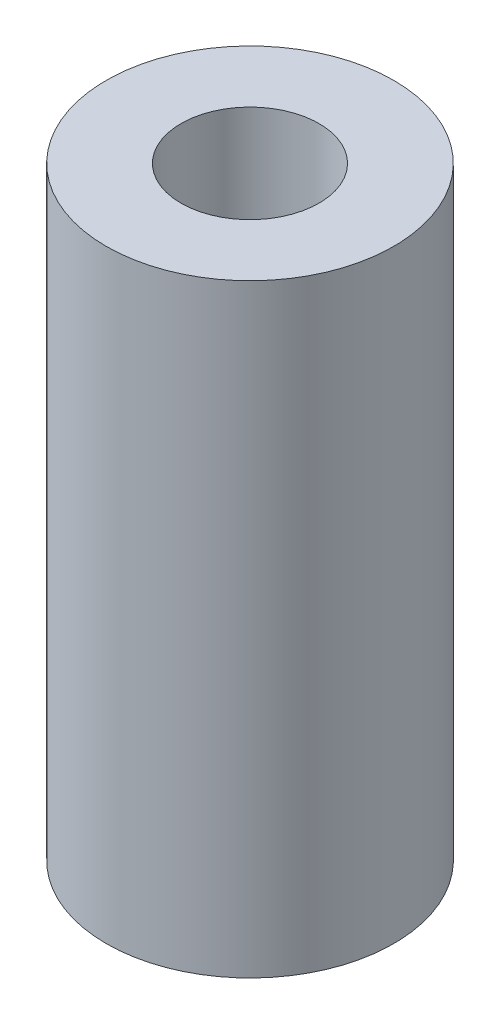
ISO-10303-21;
HEADER;
FILE_DESCRIPTION(('STEP AP214'),'2;1');
FILE_NAME('part.step','',(''),(''),'','','');
FILE_SCHEMA(('AUTOMOTIVE_DESIGN { 1 0 10303 214 1 1 1 1 }'));
ENDSEC;
DATA;
#1=APPLICATION_CONTEXT('core data for automotive mechanical design processes');
#2=APPLICATION_PROTOCOL_DEFINITION('international standard','automotive_design',2000,#1);
#3=PRODUCT_CONTEXT('',#1,'mechanical');
#4=PRODUCT('Part','Part','',(#3));
#5=PRODUCT_RELATED_PRODUCT_CATEGORY('part','',(#4));
#6=PRODUCT_DEFINITION_FORMATION('','',#4);
#7=PRODUCT_DEFINITION_CONTEXT('part definition',#1,'design');
#8=PRODUCT_DEFINITION('design','',#6,#7);
#9=PRODUCT_DEFINITION_SHAPE('','',#8);
#10=(LENGTH_UNIT() NAMED_UNIT(*) SI_UNIT(.MILLI.,.METRE.));
#11=(NAMED_UNIT(*) PLANE_ANGLE_UNIT() SI_UNIT($,.RADIAN.));
#12=(NAMED_UNIT(*) SI_UNIT($,.STERADIAN.) SOLID_ANGLE_UNIT());
#13=UNCERTAINTY_MEASURE_WITH_UNIT(LENGTH_MEASURE(1.E-05),#10,'distance_accuracy_value','');
#14=(GEOMETRIC_REPRESENTATION_CONTEXT(3) GLOBAL_UNCERTAINTY_ASSIGNED_CONTEXT((#13)) GLOBAL_UNIT_ASSIGNED_CONTEXT((#10,
#11,#12)) REPRESENTATION_CONTEXT('',''));
#15=CARTESIAN_POINT('',(0.,0.,0.));
#16=DIRECTION('',(0.,0.,1.));
#17=DIRECTION('',(1.,0.,0.));
#18=AXIS2_PLACEMENT_3D('',#15,#16,#17);
#19=CARTESIAN_POINT('',(0.,5.25,0.));
#20=DIRECTION('',(0.,-1.,0.));
#21=DIRECTION('',(0.,0.,-1.));
#22=AXIS2_PLACEMENT_3D('',#19,#20,#21);
#23=CYLINDRICAL_SURFACE('',#22,2.5);
#24=CARTESIAN_POINT('',(0.,5.25,0.));
#25=DIRECTION('',(0.,1.,0.));
#26=DIRECTION('',(0.,0.,1.));
#27=AXIS2_PLACEMENT_3D('',#24,#25,#26);
#28=CIRCLE('',#27,2.5);
#29=CARTESIAN_POINT('',(0.,5.25,-2.5));
#30=VERTEX_POINT('',#29);
#31=EDGE_CURVE('E10',#30,#30,#28,.T.);
#32=CARTESIAN_POINT('',(0.,-5.25,0.));
#33=DIRECTION('',(0.,1.,0.));
#34=DIRECTION('',(0.,0.,1.));
#35=AXIS2_PLACEMENT_3D('',#32,#33,#34);
#36=CIRCLE('',#35,2.5);
#37=CARTESIAN_POINT('',(0.,-5.25,-2.5));
#38=VERTEX_POINT('',#37);
#39=EDGE_CURVE('E37',#38,#38,#36,.T.);
#40=CARTESIAN_POINT('',(0.,5.25,-2.5));
#41=CARTESIAN_POINT('',(0.,5.140625,-2.5));
#42=CARTESIAN_POINT('',(0.,5.03125,-2.5));
#43=CARTESIAN_POINT('',(0.,4.8125,-2.5));
#44=CARTESIAN_POINT('',(0.,4.703125,-2.5));
#45=CARTESIAN_POINT('',(0.,4.484375,-2.5));
#46=CARTESIAN_POINT('',(0.,4.375,-2.5));
#47=CARTESIAN_POINT('',(0.,4.15625,-2.5));
#48=CARTESIAN_POINT('',(0.,4.046875,-2.5));
#49=CARTESIAN_POINT('',(0.,3.828125,-2.5));
#50=CARTESIAN_POINT('',(0.,3.71875,-2.5));
#51=CARTESIAN_POINT('',(0.,3.5,-2.5));
#52=CARTESIAN_POINT('',(0.,3.390625,-2.5));
#53=CARTESIAN_POINT('',(0.,3.171875,-2.5));
#54=CARTESIAN_POINT('',(0.,3.0625,-2.5));
#55=CARTESIAN_POINT('',(0.,2.84375,-2.5));
#56=CARTESIAN_POINT('',(0.,2.734375,-2.5));
#57=CARTESIAN_POINT('',(0.,2.515625,-2.5));
#58=CARTESIAN_POINT('',(0.,2.40625,-2.5));
#59=CARTESIAN_POINT('',(0.,2.1875,-2.5));
#60=CARTESIAN_POINT('',(0.,2.078125,-2.5));
#61=CARTESIAN_POINT('',(0.,1.859375,-2.5));
#62=CARTESIAN_POINT('',(0.,1.75,-2.5));
#63=CARTESIAN_POINT('',(0.,1.53125,-2.5));
#64=CARTESIAN_POINT('',(0.,1.421875,-2.5));
#65=CARTESIAN_POINT('',(0.,1.203125,-2.5));
#66=CARTESIAN_POINT('',(0.,1.09375,-2.5));
#67=CARTESIAN_POINT('',(0.,0.874999999999999,-2.5));
#68=CARTESIAN_POINT('',(0.,0.765624999999999,-2.5));
#69=CARTESIAN_POINT('',(0.,0.546875,-2.5));
#70=CARTESIAN_POINT('',(0.,0.4375,-2.5));
#71=CARTESIAN_POINT('',(0.,0.218749999999999,-2.5));
#72=CARTESIAN_POINT('',(0.,0.109374999999999,-2.5));
#73=CARTESIAN_POINT('',(0.,-0.109375000000001,-2.5));
#74=CARTESIAN_POINT('',(0.,-0.218750000000001,-2.5));
#75=CARTESIAN_POINT('',(0.,-0.437500000000001,-2.5));
#76=CARTESIAN_POINT('',(0.,-0.546875000000001,-2.5));
#77=CARTESIAN_POINT('',(0.,-0.765625000000001,-2.5));
#78=CARTESIAN_POINT('',(0.,-0.875000000000001,-2.5));
#79=CARTESIAN_POINT('',(0.,-1.09375,-2.5));
#80=CARTESIAN_POINT('',(0.,-1.203125,-2.5));
#81=CARTESIAN_POINT('',(0.,-1.421875,-2.5));
#82=CARTESIAN_POINT('',(0.,-1.53125,-2.5));
#83=CARTESIAN_POINT('',(0.,-1.75,-2.5));
#84=CARTESIAN_POINT('',(0.,-1.859375,-2.5));
#85=CARTESIAN_POINT('',(0.,-2.078125,-2.5));
#86=CARTESIAN_POINT('',(0.,-2.1875,-2.5));
#87=CARTESIAN_POINT('',(0.,-2.40625,-2.5));
#88=CARTESIAN_POINT('',(0.,-2.515625,-2.5));
#89=CARTESIAN_POINT('',(0.,-2.734375,-2.5));
#90=CARTESIAN_POINT('',(0.,-2.84375,-2.5));
#91=CARTESIAN_POINT('',(0.,-3.0625,-2.5));
#92=CARTESIAN_POINT('',(0.,-3.171875,-2.5));
#93=CARTESIAN_POINT('',(0.,-3.390625,-2.5));
#94=CARTESIAN_POINT('',(0.,-3.5,-2.5));
#95=CARTESIAN_POINT('',(0.,-3.71875,-2.5));
#96=CARTESIAN_POINT('',(0.,-3.828125,-2.5));
#97=CARTESIAN_POINT('',(0.,-4.046875,-2.5));
#98=CARTESIAN_POINT('',(0.,-4.15625,-2.5));
#99=CARTESIAN_POINT('',(0.,-4.375,-2.5));
#100=CARTESIAN_POINT('',(0.,-4.484375,-2.5));
#101=CARTESIAN_POINT('',(0.,-4.703125,-2.5));
#102=CARTESIAN_POINT('',(0.,-4.8125,-2.5));
#103=CARTESIAN_POINT('',(0.,-5.03125,-2.5));
#104=CARTESIAN_POINT('',(0.,-5.140625,-2.5));
#105=CARTESIAN_POINT('',(0.,-5.25,-2.5));
#106=B_SPLINE_CURVE_WITH_KNOTS('',3,(#40,#41,#42,#43,#44,#45,#46,#47,#48,#49,#50,#51,#52,#53,
#54,#55,#56,#57,#58,#59,#60,#61,#62,#63,#64,#65,#66,#67,#68,#69,#70,#71,#72,#73,#74,#75,#76,#77,
#78,#79,#80,#81,#82,#83,#84,#85,#86,#87,#88,#89,#90,#91,#92,#93,#94,#95,#96,#97,#98,#99,#100,
#101,#102,#103,#104,#105),.UNSPECIFIED.,.F.,.F.,(4,2,2,2,2,2,2,2,2,2,2,2,2,2,2,2,2,2,2,2,2,2,2,
2,2,2,2,2,2,2,2,2,4),(0.,0.328124999999999,0.65625,0.984374999999999,1.3125,1.640625,1.96875,
2.296875,2.625,2.953125,3.28125,3.609375,3.9375,4.265625,4.59375,4.921875,5.25,5.578125,5.90625,
6.234375,6.5625,6.890625,7.21875,7.546875,7.875,8.203125,8.53125,8.859375,9.1875,9.515625,
9.84375,10.171875,10.5),.UNSPECIFIED.);
#107=EDGE_CURVE('BSEAM34',#30,#38,#106,.T.);
#108=ORIENTED_EDGE('',*,*,#31,.F.);
#109=ORIENTED_EDGE('',*,*,#39,.T.);
#110=ORIENTED_EDGE('',*,*,#107,.T.);
#111=ORIENTED_EDGE('',*,*,#107,.F.);
#112=EDGE_LOOP('',(#108,#110,#109,#111));
#113=FACE_BOUND('',#112,.T.);
#114=ADVANCED_FACE('F34',(#113),#23,.T.);
#115=CARTESIAN_POINT('',(0.,5.25,0.));
#116=DIRECTION('',(0.,1.,0.));
#117=DIRECTION('',(0.,0.,1.));
#118=AXIS2_PLACEMENT_3D('',#115,#116,#117);
#119=PLANE('',#118);
#120=CARTESIAN_POINT('',(0.,5.25,0.));
#121=DIRECTION('',(0.,1.,0.));
#122=DIRECTION('',(0.,0.,1.));
#123=AXIS2_PLACEMENT_3D('',#120,#121,#122);
#124=CIRCLE('',#123,1.2);
#125=CARTESIAN_POINT('',(0.,5.25,1.2));
#126=VERTEX_POINT('',#125);
#127=EDGE_CURVE('E48',#126,#126,#124,.T.);
#128=ORIENTED_EDGE('',*,*,#127,.F.);
#129=EDGE_LOOP('',(#128));
#130=FACE_BOUND('',#129,.T.);
#131=ORIENTED_EDGE('',*,*,#31,.T.);
#132=EDGE_LOOP('',(#131));
#133=FACE_BOUND('',#132,.T.);
#134=ADVANCED_FACE('F54',(#130,#133),#119,.T.);
#135=CARTESIAN_POINT('',(0.,-5.25,0.));
#136=DIRECTION('',(0.,1.,0.));
#137=DIRECTION('',(0.,0.,1.));
#138=AXIS2_PLACEMENT_3D('',#135,#136,#137);
#139=PLANE('',#138);
#140=CARTESIAN_POINT('',(0.,-5.25,0.));
#141=DIRECTION('',(0.,1.,0.));
#142=DIRECTION('',(0.,0.,1.));
#143=AXIS2_PLACEMENT_3D('',#140,#141,#142);
#144=CIRCLE('',#143,1.2);
#145=CARTESIAN_POINT('',(0.,-5.25,1.2));
#146=VERTEX_POINT('',#145);
#147=EDGE_CURVE('E44',#146,#146,#144,.T.);
#148=ORIENTED_EDGE('',*,*,#147,.T.);
#149=EDGE_LOOP('',(#148));
#150=FACE_BOUND('',#149,.T.);
#151=ORIENTED_EDGE('',*,*,#39,.F.);
#152=EDGE_LOOP('',(#151));
#153=FACE_BOUND('',#152,.T.);
#154=ADVANCED_FACE('F56',(#150,#153),#139,.F.);
#155=CARTESIAN_POINT('',(0.,5.25,0.));
#156=DIRECTION('',(0.,1.,0.));
#157=DIRECTION('',(0.,0.,1.));
#158=AXIS2_PLACEMENT_3D('',#155,#156,#157);
#159=CYLINDRICAL_SURFACE('',#158,1.2);
#160=ORIENTED_EDGE('',*,*,#147,.F.);
#161=EDGE_LOOP('',(#160));
#162=FACE_BOUND('',#161,.T.);
#163=ORIENTED_EDGE('',*,*,#127,.T.);
#164=EDGE_LOOP('',(#163));
#165=FACE_BOUND('',#164,.T.);
#166=ADVANCED_FACE('F52',(#162,#165),#159,.F.);
#167=CLOSED_SHELL('',(#114,#134,#154,#166));
#168=MANIFOLD_SOLID_BREP('B2',#167);
#169=ADVANCED_BREP_SHAPE_REPRESENTATION('',(#18,#168),#14);
#170=SHAPE_DEFINITION_REPRESENTATION(#9,#169);
ENDSEC;
END-ISO-10303-21;
